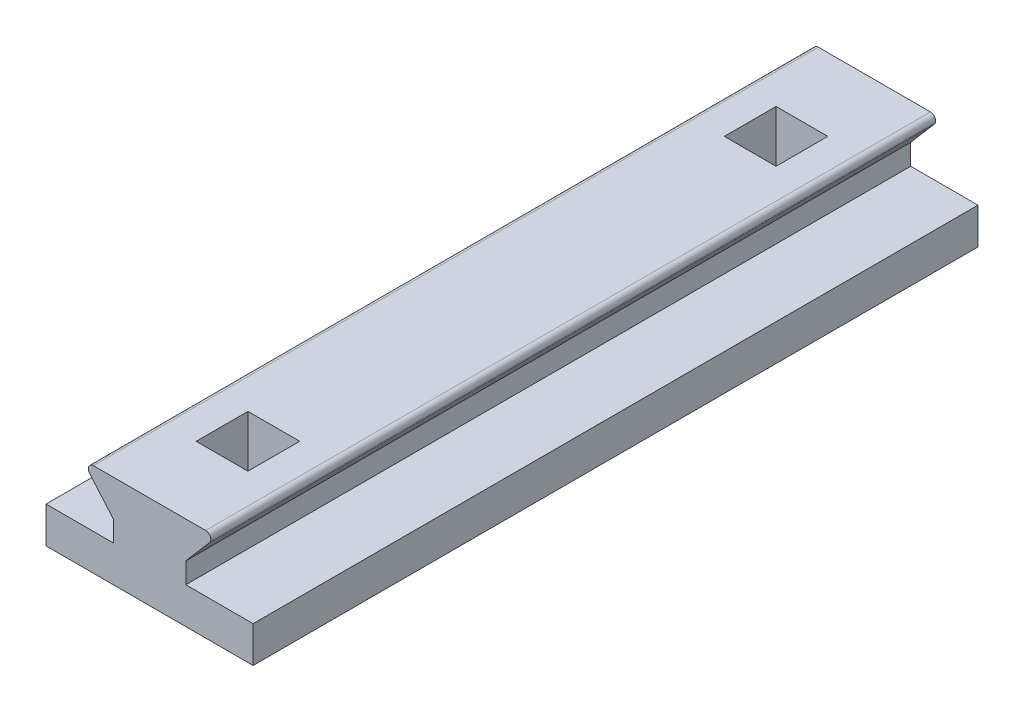
ISO-10303-21;
HEADER;
FILE_DESCRIPTION(('STEP AP214'),'2;1');
FILE_NAME('part.step','',(''),(''),'','','');
FILE_SCHEMA(('AUTOMOTIVE_DESIGN { 1 0 10303 214 1 1 1 1 }'));
ENDSEC;
DATA;
#1=APPLICATION_CONTEXT('core data for automotive mechanical design processes');
#2=APPLICATION_PROTOCOL_DEFINITION('international standard','automotive_design',2000,#1);
#3=PRODUCT_CONTEXT('',#1,'mechanical');
#4=PRODUCT('Part','Part','',(#3));
#5=PRODUCT_RELATED_PRODUCT_CATEGORY('part','',(#4));
#6=PRODUCT_DEFINITION_FORMATION('','',#4);
#7=PRODUCT_DEFINITION_CONTEXT('part definition',#1,'design');
#8=PRODUCT_DEFINITION('design','',#6,#7);
#9=PRODUCT_DEFINITION_SHAPE('','',#8);
#10=(LENGTH_UNIT() NAMED_UNIT(*) SI_UNIT(.MILLI.,.METRE.));
#11=(NAMED_UNIT(*) PLANE_ANGLE_UNIT() SI_UNIT($,.RADIAN.));
#12=(NAMED_UNIT(*) SI_UNIT($,.STERADIAN.) SOLID_ANGLE_UNIT());
#13=UNCERTAINTY_MEASURE_WITH_UNIT(LENGTH_MEASURE(1.E-05),#10,'distance_accuracy_value','');
#14=(GEOMETRIC_REPRESENTATION_CONTEXT(3) GLOBAL_UNCERTAINTY_ASSIGNED_CONTEXT((#13)) GLOBAL_UNIT_ASSIGNED_CONTEXT((#10,
#11,#12)) REPRESENTATION_CONTEXT('',''));
#15=CARTESIAN_POINT('',(0.,0.,0.));
#16=DIRECTION('',(0.,0.,1.));
#17=DIRECTION('',(1.,0.,0.));
#18=AXIS2_PLACEMENT_3D('',#15,#16,#17);
#19=CARTESIAN_POINT('',(0.,3.5,70.));
#20=DIRECTION('',(1.,0.,0.));
#21=DIRECTION('',(0.,1.,0.));
#22=AXIS2_PLACEMENT_3D('',#19,#20,#21);
#23=PLANE('',#22);
#24=DIRECTION('',(0.,-1.,0.));
#25=VECTOR('',#24,1.);
#26=CARTESIAN_POINT('',(0.,3.5,0.));
#27=LINE('',#26,#25);
#28=CARTESIAN_POINT('',(0.,3.5,0.));
#29=VERTEX_POINT('',#28);
#30=CARTESIAN_POINT('',(0.,0.,0.));
#31=VERTEX_POINT('',#30);
#32=EDGE_CURVE('E208',#29,#31,#27,.T.);
#33=ORIENTED_EDGE('',*,*,#32,.T.);
#34=DIRECTION('',(0.,0.,-1.));
#35=VECTOR('',#34,1.);
#36=CARTESIAN_POINT('',(0.,0.,70.));
#37=LINE('',#36,#35);
#38=CARTESIAN_POINT('',(0.,0.,70.));
#39=VERTEX_POINT('',#38);
#40=EDGE_CURVE('E308',#39,#31,#37,.T.);
#41=ORIENTED_EDGE('',*,*,#40,.F.);
#42=DIRECTION('',(0.,-1.,0.));
#43=VECTOR('',#42,1.);
#44=CARTESIAN_POINT('',(0.,3.5,70.));
#45=LINE('',#44,#43);
#46=CARTESIAN_POINT('',(0.,3.5,70.));
#47=VERTEX_POINT('',#46);
#48=EDGE_CURVE('E242',#47,#39,#45,.T.);
#49=ORIENTED_EDGE('',*,*,#48,.F.);
#50=DIRECTION('',(0.,0.,-1.));
#51=VECTOR('',#50,1.);
#52=CARTESIAN_POINT('',(0.,3.5,70.));
#53=LINE('',#52,#51);
#54=EDGE_CURVE('E266',#47,#29,#53,.T.);
#55=ORIENTED_EDGE('',*,*,#54,.T.);
#56=EDGE_LOOP('',(#33,#41,#49,#55));
#57=FACE_BOUND('',#56,.T.);
#58=ADVANCED_FACE('F33',(#57),#23,.F.);
#59=CARTESIAN_POINT('',(0.,0.,70.));
#60=DIRECTION('',(0.,1.,0.));
#61=DIRECTION('',(0.,0.,1.));
#62=AXIS2_PLACEMENT_3D('',#59,#60,#61);
#63=PLANE('',#62);
#64=CARTESIAN_POINT('',(10.,0.,9.5));
#65=DIRECTION('',(0.,1.,0.));
#66=DIRECTION('',(0.,0.,1.));
#67=AXIS2_PLACEMENT_3D('',#64,#65,#66);
#68=CIRCLE('',#67,2.);
#69=CARTESIAN_POINT('',(10.,0.,11.5));
#70=VERTEX_POINT('',#69);
#71=EDGE_CURVE('E228',#70,#70,#68,.T.);
#72=ORIENTED_EDGE('',*,*,#71,.T.);
#73=EDGE_LOOP('',(#72));
#74=FACE_BOUND('',#73,.T.);
#75=CARTESIAN_POINT('',(10.,0.,60.5));
#76=DIRECTION('',(0.,1.,0.));
#77=DIRECTION('',(0.,0.,1.));
#78=AXIS2_PLACEMENT_3D('',#75,#76,#77);
#79=CIRCLE('',#78,2.);
#80=CARTESIAN_POINT('',(10.,0.,62.5));
#81=VERTEX_POINT('',#80);
#82=EDGE_CURVE('E465',#81,#81,#79,.T.);
#83=ORIENTED_EDGE('',*,*,#82,.T.);
#84=EDGE_LOOP('',(#83));
#85=FACE_BOUND('',#84,.T.);
#86=DIRECTION('',(1.,0.,0.));
#87=VECTOR('',#86,1.);
#88=CARTESIAN_POINT('',(0.,0.,0.));
#89=LINE('',#88,#87);
#90=CARTESIAN_POINT('',(20.,0.,0.));
#91=VERTEX_POINT('',#90);
#92=EDGE_CURVE('E269',#31,#91,#89,.T.);
#93=ORIENTED_EDGE('',*,*,#92,.T.);
#94=DIRECTION('',(0.,0.,-1.));
#95=VECTOR('',#94,1.);
#96=CARTESIAN_POINT('',(20.,0.,70.));
#97=LINE('',#96,#95);
#98=CARTESIAN_POINT('',(20.,0.,70.));
#99=VERTEX_POINT('',#98);
#100=EDGE_CURVE('E305',#99,#91,#97,.T.);
#101=ORIENTED_EDGE('',*,*,#100,.F.);
#102=DIRECTION('',(1.,0.,0.));
#103=VECTOR('',#102,1.);
#104=CARTESIAN_POINT('',(0.,0.,70.));
#105=LINE('',#104,#103);
#106=EDGE_CURVE('E245',#39,#99,#105,.T.);
#107=ORIENTED_EDGE('',*,*,#106,.F.);
#108=ORIENTED_EDGE('',*,*,#40,.T.);
#109=EDGE_LOOP('',(#93,#101,#107,#108));
#110=FACE_BOUND('',#109,.T.);
#111=ADVANCED_FACE('F359',(#74,#85,#110),#63,.F.);
#112=CARTESIAN_POINT('',(20.,0.,70.));
#113=DIRECTION('',(-1.,0.,0.));
#114=DIRECTION('',(0.,0.,1.));
#115=AXIS2_PLACEMENT_3D('',#112,#113,#114);
#116=PLANE('',#115);
#117=DIRECTION('',(0.,1.,0.));
#118=VECTOR('',#117,1.);
#119=CARTESIAN_POINT('',(20.,0.,0.));
#120=LINE('',#119,#118);
#121=CARTESIAN_POINT('',(20.,3.5,0.));
#122=VERTEX_POINT('',#121);
#123=EDGE_CURVE('E271',#91,#122,#120,.T.);
#124=ORIENTED_EDGE('',*,*,#123,.T.);
#125=DIRECTION('',(0.,0.,-1.));
#126=VECTOR('',#125,1.);
#127=CARTESIAN_POINT('',(20.,3.5,70.));
#128=LINE('',#127,#126);
#129=CARTESIAN_POINT('',(20.,3.5,70.));
#130=VERTEX_POINT('',#129);
#131=EDGE_CURVE('E302',#130,#122,#128,.T.);
#132=ORIENTED_EDGE('',*,*,#131,.F.);
#133=DIRECTION('',(0.,1.,0.));
#134=VECTOR('',#133,1.);
#135=CARTESIAN_POINT('',(20.,0.,70.));
#136=LINE('',#135,#134);
#137=EDGE_CURVE('E248',#99,#130,#136,.T.);
#138=ORIENTED_EDGE('',*,*,#137,.F.);
#139=ORIENTED_EDGE('',*,*,#100,.T.);
#140=EDGE_LOOP('',(#124,#132,#138,#139));
#141=FACE_BOUND('',#140,.T.);
#142=ADVANCED_FACE('F364',(#141),#116,.F.);
#143=CARTESIAN_POINT('',(20.,3.5,70.));
#144=DIRECTION('',(0.,-1.,0.));
#145=DIRECTION('',(1.,0.,0.));
#146=AXIS2_PLACEMENT_3D('',#143,#144,#145);
#147=PLANE('',#146);
#148=DIRECTION('',(-1.,0.,0.));
#149=VECTOR('',#148,1.);
#150=CARTESIAN_POINT('',(20.,3.5,0.));
#151=LINE('',#150,#149);
#152=CARTESIAN_POINT('',(13.5,3.5,0.));
#153=VERTEX_POINT('',#152);
#154=EDGE_CURVE('E273',#122,#153,#151,.T.);
#155=ORIENTED_EDGE('',*,*,#154,.T.);
#156=DIRECTION('',(0.,0.,-1.));
#157=VECTOR('',#156,1.);
#158=CARTESIAN_POINT('',(13.5,3.5,70.));
#159=LINE('',#158,#157);
#160=CARTESIAN_POINT('',(13.5,3.5,70.));
#161=VERTEX_POINT('',#160);
#162=EDGE_CURVE('E299',#161,#153,#159,.T.);
#163=ORIENTED_EDGE('',*,*,#162,.F.);
#164=DIRECTION('',(-1.,0.,0.));
#165=VECTOR('',#164,1.);
#166=CARTESIAN_POINT('',(20.,3.5,70.));
#167=LINE('',#166,#165);
#168=EDGE_CURVE('E250',#130,#161,#167,.T.);
#169=ORIENTED_EDGE('',*,*,#168,.F.);
#170=ORIENTED_EDGE('',*,*,#131,.T.);
#171=EDGE_LOOP('',(#155,#163,#169,#170));
#172=FACE_BOUND('',#171,.T.);
#173=ADVANCED_FACE('F370',(#172),#147,.F.);
#174=CARTESIAN_POINT('',(13.5,3.5,70.));
#175=DIRECTION('',(-1.,0.,0.));
#176=DIRECTION('',(0.,0.,1.));
#177=AXIS2_PLACEMENT_3D('',#174,#175,#176);
#178=PLANE('',#177);
#179=DIRECTION('',(0.,1.,0.));
#180=VECTOR('',#179,1.);
#181=CARTESIAN_POINT('',(13.5,3.5,0.));
#182=LINE('',#181,#180);
#183=CARTESIAN_POINT('',(13.5,5.5,0.));
#184=VERTEX_POINT('',#183);
#185=EDGE_CURVE('E275',#153,#184,#182,.T.);
#186=ORIENTED_EDGE('',*,*,#185,.T.);
#187=DIRECTION('',(0.,0.,-1.));
#188=VECTOR('',#187,1.);
#189=CARTESIAN_POINT('',(13.5,5.5,70.));
#190=LINE('',#189,#188);
#191=CARTESIAN_POINT('',(13.5,5.5,70.));
#192=VERTEX_POINT('',#191);
#193=EDGE_CURVE('E296',#192,#184,#190,.T.);
#194=ORIENTED_EDGE('',*,*,#193,.F.);
#195=DIRECTION('',(0.,1.,0.));
#196=VECTOR('',#195,1.);
#197=CARTESIAN_POINT('',(13.5,3.5,70.));
#198=LINE('',#197,#196);
#199=EDGE_CURVE('E252',#161,#192,#198,.T.);
#200=ORIENTED_EDGE('',*,*,#199,.F.);
#201=ORIENTED_EDGE('',*,*,#162,.T.);
#202=EDGE_LOOP('',(#186,#194,#200,#201));
#203=FACE_BOUND('',#202,.T.);
#204=ADVANCED_FACE('F374',(#203),#178,.F.);
#205=CARTESIAN_POINT('',(16.5,9.,70.));
#206=DIRECTION('',(-0.759256602365297,0.650791373455968,0.));
#207=DIRECTION('',(-0.650791373455968,-0.759256602365297,0.));
#208=AXIS2_PLACEMENT_3D('',#205,#206,#207);
#209=PLANE('',#208);
#210=DIRECTION('',(0.650791373455968,0.759256602365297,0.));
#211=VECTOR('',#210,1.);
#212=CARTESIAN_POINT('',(16.5,9.,0.));
#213=LINE('',#212,#211);
#214=CARTESIAN_POINT('',(15.7925179828046,8.17460431327201,0.));
#215=VERTEX_POINT('',#214);
#216=EDGE_CURVE('E277',#184,#215,#213,.T.);
#217=ORIENTED_EDGE('',*,*,#216,.T.);
#218=DIRECTION('',(0.,0.,-1.));
#219=VECTOR('',#218,1.);
#220=CARTESIAN_POINT('',(15.7925179828046,8.17460431327201,70.));
#221=LINE('',#220,#219);
#222=CARTESIAN_POINT('',(15.7925179828046,8.17460431327201,70.));
#223=VERTEX_POINT('',#222);
#224=EDGE_CURVE('E316',#215,#223,#221,.F.);
#225=ORIENTED_EDGE('',*,*,#224,.T.);
#226=DIRECTION('',(0.650791373455968,0.759256602365297,0.));
#227=VECTOR('',#226,1.);
#228=CARTESIAN_POINT('',(16.5,9.,70.));
#229=LINE('',#228,#227);
#230=EDGE_CURVE('E254',#192,#223,#229,.T.);
#231=ORIENTED_EDGE('',*,*,#230,.F.);
#232=ORIENTED_EDGE('',*,*,#193,.T.);
#233=EDGE_LOOP('',(#217,#225,#231,#232));
#234=FACE_BOUND('',#233,.T.);
#235=ADVANCED_FACE('F378',(#234),#209,.F.);
#236=CARTESIAN_POINT('',(16.5,9.,70.));
#237=DIRECTION('',(0.,-1.,0.));
#238=DIRECTION('',(1.,0.,0.));
#239=AXIS2_PLACEMENT_3D('',#236,#237,#238);
#240=PLANE('',#239);
#241=DIRECTION('',(-1.,0.,0.));
#242=VECTOR('',#241,1.);
#243=CARTESIAN_POINT('',(12.5,9.,7.));
#244=LINE('',#243,#242);
#245=CARTESIAN_POINT('',(12.5,9.,7.00000000000001));
#246=VERTEX_POINT('',#245);
#247=CARTESIAN_POINT('',(7.5,9.,7.));
#248=VERTEX_POINT('',#247);
#249=EDGE_CURVE('E201',#246,#248,#244,.T.);
#250=ORIENTED_EDGE('',*,*,#249,.F.);
#251=DIRECTION('',(0.,0.,-1.));
#252=VECTOR('',#251,1.);
#253=CARTESIAN_POINT('',(12.5,9.,12.));
#254=LINE('',#253,#252);
#255=CARTESIAN_POINT('',(12.5,9.,12.));
#256=VERTEX_POINT('',#255);
#257=EDGE_CURVE('E48',#256,#246,#254,.T.);
#258=ORIENTED_EDGE('',*,*,#257,.F.);
#259=DIRECTION('',(1.,0.,0.));
#260=VECTOR('',#259,1.);
#261=CARTESIAN_POINT('',(12.5,9.,12.));
#262=LINE('',#261,#260);
#263=CARTESIAN_POINT('',(7.5,9.,12.));
#264=VERTEX_POINT('',#263);
#265=EDGE_CURVE('E189',#264,#256,#262,.T.);
#266=ORIENTED_EDGE('',*,*,#265,.F.);
#267=DIRECTION('',(0.,0.,1.));
#268=VECTOR('',#267,1.);
#269=CARTESIAN_POINT('',(7.5,9.,12.));
#270=LINE('',#269,#268);
#271=EDGE_CURVE('E192',#248,#264,#270,.T.);
#272=ORIENTED_EDGE('',*,*,#271,.F.);
#273=EDGE_LOOP('',(#250,#258,#266,#272));
#274=FACE_BOUND('',#273,.T.);
#275=DIRECTION('',(-1.,0.,0.));
#276=VECTOR('',#275,1.);
#277=CARTESIAN_POINT('',(12.5,9.,58.));
#278=LINE('',#277,#276);
#279=CARTESIAN_POINT('',(12.5,9.,58.));
#280=VERTEX_POINT('',#279);
#281=CARTESIAN_POINT('',(7.5,9.,58.));
#282=VERTEX_POINT('',#281);
#283=EDGE_CURVE('E227',#280,#282,#278,.T.);
#284=ORIENTED_EDGE('',*,*,#283,.F.);
#285=DIRECTION('',(0.,0.,-1.));
#286=VECTOR('',#285,1.);
#287=CARTESIAN_POINT('',(12.5,9.,63.));
#288=LINE('',#287,#286);
#289=CARTESIAN_POINT('',(12.5,9.,63.));
#290=VERTEX_POINT('',#289);
#291=EDGE_CURVE('E56',#290,#280,#288,.T.);
#292=ORIENTED_EDGE('',*,*,#291,.F.);
#293=DIRECTION('',(1.,0.,0.));
#294=VECTOR('',#293,1.);
#295=CARTESIAN_POINT('',(12.5,9.,63.));
#296=LINE('',#295,#294);
#297=CARTESIAN_POINT('',(7.5,9.,63.));
#298=VERTEX_POINT('',#297);
#299=EDGE_CURVE('E216',#298,#290,#296,.T.);
#300=ORIENTED_EDGE('',*,*,#299,.F.);
#301=DIRECTION('',(0.,0.,1.));
#302=VECTOR('',#301,1.);
#303=CARTESIAN_POINT('',(7.5,9.,63.));
#304=LINE('',#303,#302);
#305=EDGE_CURVE('E231',#282,#298,#304,.T.);
#306=ORIENTED_EDGE('',*,*,#305,.F.);
#307=EDGE_LOOP('',(#284,#292,#300,#306));
#308=FACE_BOUND('',#307,.T.);
#309=DIRECTION('',(-1.,0.,0.));
#310=VECTOR('',#309,1.);
#311=CARTESIAN_POINT('',(16.5,9.,0.));
#312=LINE('',#311,#310);
#313=CARTESIAN_POINT('',(15.4128896816219,9.,0.));
#314=VERTEX_POINT('',#313);
#315=CARTESIAN_POINT('',(4.58711031837806,9.,0.));
#316=VERTEX_POINT('',#315);
#317=EDGE_CURVE('E280',#314,#316,#312,.T.);
#318=ORIENTED_EDGE('',*,*,#317,.T.);
#319=DIRECTION('',(0.,0.,-1.));
#320=VECTOR('',#319,1.);
#321=CARTESIAN_POINT('',(4.58711031837806,9.,70.));
#322=LINE('',#321,#320);
#323=CARTESIAN_POINT('',(4.58711031837806,9.,70.));
#324=VERTEX_POINT('',#323);
#325=EDGE_CURVE('E41',#316,#324,#322,.F.);
#326=ORIENTED_EDGE('',*,*,#325,.T.);
#327=DIRECTION('',(-1.,0.,0.));
#328=VECTOR('',#327,1.);
#329=CARTESIAN_POINT('',(16.5,9.,70.));
#330=LINE('',#329,#328);
#331=CARTESIAN_POINT('',(15.4128896816219,9.,70.));
#332=VERTEX_POINT('',#331);
#333=EDGE_CURVE('E257',#332,#324,#330,.T.);
#334=ORIENTED_EDGE('',*,*,#333,.F.);
#335=DIRECTION('',(0.,0.,-1.));
#336=VECTOR('',#335,1.);
#337=CARTESIAN_POINT('',(15.4128896816219,9.,70.));
#338=LINE('',#337,#336);
#339=EDGE_CURVE('E311',#332,#314,#338,.T.);
#340=ORIENTED_EDGE('',*,*,#339,.T.);
#341=EDGE_LOOP('',(#318,#326,#334,#340));
#342=FACE_BOUND('',#341,.T.);
#343=ADVANCED_FACE('F327',(#274,#308,#342),#240,.F.);
#344=CARTESIAN_POINT('',(3.5,9.,70.));
#345=DIRECTION('',(0.759256602365296,0.650791373455969,0.));
#346=DIRECTION('',(-0.650791373455969,0.759256602365296,0.));
#347=AXIS2_PLACEMENT_3D('',#344,#345,#346);
#348=PLANE('',#347);
#349=DIRECTION('',(0.650791373455969,-0.759256602365296,0.));
#350=VECTOR('',#349,1.);
#351=CARTESIAN_POINT('',(3.5,9.,70.));
#352=LINE('',#351,#350);
#353=CARTESIAN_POINT('',(4.20748201719542,8.17460431327201,70.));
#354=VERTEX_POINT('',#353);
#355=CARTESIAN_POINT('',(6.5,5.5,70.));
#356=VERTEX_POINT('',#355);
#357=EDGE_CURVE('E260',#354,#356,#352,.T.);
#358=ORIENTED_EDGE('',*,*,#357,.F.);
#359=DIRECTION('',(0.,0.,-1.));
#360=VECTOR('',#359,1.);
#361=CARTESIAN_POINT('',(4.20748201719542,8.17460431327201,70.));
#362=LINE('',#361,#360);
#363=CARTESIAN_POINT('',(4.20748201719542,8.17460431327201,0.));
#364=VERTEX_POINT('',#363);
#365=EDGE_CURVE('E320',#354,#364,#362,.T.);
#366=ORIENTED_EDGE('',*,*,#365,.T.);
#367=DIRECTION('',(0.650791373455969,-0.759256602365296,0.));
#368=VECTOR('',#367,1.);
#369=CARTESIAN_POINT('',(3.5,9.,0.));
#370=LINE('',#369,#368);
#371=CARTESIAN_POINT('',(6.5,5.5,0.));
#372=VERTEX_POINT('',#371);
#373=EDGE_CURVE('E283',#364,#372,#370,.T.);
#374=ORIENTED_EDGE('',*,*,#373,.T.);
#375=DIRECTION('',(0.,0.,-1.));
#376=VECTOR('',#375,1.);
#377=CARTESIAN_POINT('',(6.5,5.5,70.));
#378=LINE('',#377,#376);
#379=EDGE_CURVE('E293',#356,#372,#378,.T.);
#380=ORIENTED_EDGE('',*,*,#379,.F.);
#381=EDGE_LOOP('',(#358,#366,#374,#380));
#382=FACE_BOUND('',#381,.T.);
#383=ADVANCED_FACE('F339',(#382),#348,.F.);
#384=CARTESIAN_POINT('',(6.5,5.5,70.));
#385=DIRECTION('',(1.,0.,0.));
#386=DIRECTION('',(0.,1.,0.));
#387=AXIS2_PLACEMENT_3D('',#384,#385,#386);
#388=PLANE('',#387);
#389=DIRECTION('',(0.,-1.,0.));
#390=VECTOR('',#389,1.);
#391=CARTESIAN_POINT('',(6.5,5.5,0.));
#392=LINE('',#391,#390);
#393=CARTESIAN_POINT('',(6.5,3.5,0.));
#394=VERTEX_POINT('',#393);
#395=EDGE_CURVE('E285',#372,#394,#392,.T.);
#396=ORIENTED_EDGE('',*,*,#395,.T.);
#397=DIRECTION('',(0.,0.,-1.));
#398=VECTOR('',#397,1.);
#399=CARTESIAN_POINT('',(6.5,3.5,70.));
#400=LINE('',#399,#398);
#401=CARTESIAN_POINT('',(6.5,3.5,70.));
#402=VERTEX_POINT('',#401);
#403=EDGE_CURVE('E290',#402,#394,#400,.T.);
#404=ORIENTED_EDGE('',*,*,#403,.F.);
#405=DIRECTION('',(0.,-1.,0.));
#406=VECTOR('',#405,1.);
#407=CARTESIAN_POINT('',(6.5,5.5,70.));
#408=LINE('',#407,#406);
#409=EDGE_CURVE('E262',#356,#402,#408,.T.);
#410=ORIENTED_EDGE('',*,*,#409,.F.);
#411=ORIENTED_EDGE('',*,*,#379,.T.);
#412=EDGE_LOOP('',(#396,#404,#410,#411));
#413=FACE_BOUND('',#412,.T.);
#414=ADVANCED_FACE('F348',(#413),#388,.F.);
#415=CARTESIAN_POINT('',(6.5,3.5,70.));
#416=DIRECTION('',(0.,-1.,0.));
#417=DIRECTION('',(1.,0.,0.));
#418=AXIS2_PLACEMENT_3D('',#415,#416,#417);
#419=PLANE('',#418);
#420=DIRECTION('',(-1.,0.,0.));
#421=VECTOR('',#420,1.);
#422=CARTESIAN_POINT('',(6.5,3.5,0.));
#423=LINE('',#422,#421);
#424=EDGE_CURVE('E246',#394,#29,#423,.T.);
#425=ORIENTED_EDGE('',*,*,#424,.T.);
#426=ORIENTED_EDGE('',*,*,#54,.F.);
#427=DIRECTION('',(-1.,0.,0.));
#428=VECTOR('',#427,1.);
#429=CARTESIAN_POINT('',(6.5,3.5,70.));
#430=LINE('',#429,#428);
#431=EDGE_CURVE('E264',#402,#47,#430,.T.);
#432=ORIENTED_EDGE('',*,*,#431,.F.);
#433=ORIENTED_EDGE('',*,*,#403,.T.);
#434=EDGE_LOOP('',(#425,#426,#432,#433));
#435=FACE_BOUND('',#434,.T.);
#436=ADVANCED_FACE('F352',(#435),#419,.F.);
#437=CARTESIAN_POINT('',(0.,0.,70.));
#438=DIRECTION('',(0.,0.,1.));
#439=DIRECTION('',(1.,0.,0.));
#440=AXIS2_PLACEMENT_3D('',#437,#438,#439);
#441=PLANE('',#440);
#442=ORIENTED_EDGE('',*,*,#333,.T.);
#443=CARTESIAN_POINT('',(4.58711031837806,8.5,70.));
#444=DIRECTION('',(0.,0.,1.));
#445=DIRECTION('',(1.,0.,0.));
#446=AXIS2_PLACEMENT_3D('',#443,#444,#445);
#447=CIRCLE('',#446,0.5);
#448=EDGE_CURVE('E11',#324,#354,#447,.T.);
#449=ORIENTED_EDGE('',*,*,#448,.T.);
#450=ORIENTED_EDGE('',*,*,#357,.T.);
#451=ORIENTED_EDGE('',*,*,#409,.T.);
#452=ORIENTED_EDGE('',*,*,#431,.T.);
#453=ORIENTED_EDGE('',*,*,#48,.T.);
#454=ORIENTED_EDGE('',*,*,#106,.T.);
#455=ORIENTED_EDGE('',*,*,#137,.T.);
#456=ORIENTED_EDGE('',*,*,#168,.T.);
#457=ORIENTED_EDGE('',*,*,#199,.T.);
#458=ORIENTED_EDGE('',*,*,#230,.T.);
#459=CARTESIAN_POINT('',(15.4128896816219,8.5,70.));
#460=DIRECTION('',(0.,0.,1.));
#461=DIRECTION('',(1.,0.,0.));
#462=AXIS2_PLACEMENT_3D('',#459,#460,#461);
#463=CIRCLE('',#462,0.5);
#464=EDGE_CURVE('E318',#223,#332,#463,.T.);
#465=ORIENTED_EDGE('',*,*,#464,.T.);
#466=EDGE_LOOP('',(#442,#449,#450,#451,#452,#453,#454,#455,#456,#457,#458,#465));
#467=FACE_BOUND('',#466,.T.);
#468=ADVANCED_FACE('F333',(#467),#441,.T.);
#469=CARTESIAN_POINT('',(0.,0.,0.));
#470=DIRECTION('',(0.,0.,1.));
#471=DIRECTION('',(1.,0.,0.));
#472=AXIS2_PLACEMENT_3D('',#469,#470,#471);
#473=PLANE('',#472);
#474=ORIENTED_EDGE('',*,*,#373,.F.);
#475=CARTESIAN_POINT('',(4.58711031837806,8.5,0.));
#476=DIRECTION('',(0.,0.,1.));
#477=DIRECTION('',(1.,0.,0.));
#478=AXIS2_PLACEMENT_3D('',#475,#476,#477);
#479=CIRCLE('',#478,0.5);
#480=EDGE_CURVE('E323',#364,#316,#479,.F.);
#481=ORIENTED_EDGE('',*,*,#480,.T.);
#482=ORIENTED_EDGE('',*,*,#317,.F.);
#483=CARTESIAN_POINT('',(15.4128896816219,8.5,0.));
#484=DIRECTION('',(0.,0.,1.));
#485=DIRECTION('',(1.,0.,0.));
#486=AXIS2_PLACEMENT_3D('',#483,#484,#485);
#487=CIRCLE('',#486,0.5);
#488=EDGE_CURVE('E314',#314,#215,#487,.F.);
#489=ORIENTED_EDGE('',*,*,#488,.T.);
#490=ORIENTED_EDGE('',*,*,#216,.F.);
#491=ORIENTED_EDGE('',*,*,#185,.F.);
#492=ORIENTED_EDGE('',*,*,#154,.F.);
#493=ORIENTED_EDGE('',*,*,#123,.F.);
#494=ORIENTED_EDGE('',*,*,#92,.F.);
#495=ORIENTED_EDGE('',*,*,#32,.F.);
#496=ORIENTED_EDGE('',*,*,#424,.F.);
#497=ORIENTED_EDGE('',*,*,#395,.F.);
#498=EDGE_LOOP('',(#474,#481,#482,#489,#490,#491,#492,#493,#494,#495,#496,#497));
#499=FACE_BOUND('',#498,.T.);
#500=ADVANCED_FACE('F343',(#499),#473,.F.);
#501=CARTESIAN_POINT('',(15.4128896816219,8.5,70.));
#502=DIRECTION('',(0.,0.,-1.));
#503=DIRECTION('',(-1.,0.,0.));
#504=AXIS2_PLACEMENT_3D('',#501,#502,#503);
#505=CYLINDRICAL_SURFACE('',#504,0.5);
#506=ORIENTED_EDGE('',*,*,#464,.F.);
#507=ORIENTED_EDGE('',*,*,#224,.F.);
#508=ORIENTED_EDGE('',*,*,#488,.F.);
#509=ORIENTED_EDGE('',*,*,#339,.F.);
#510=EDGE_LOOP('',(#506,#507,#508,#509));
#511=FACE_BOUND('',#510,.T.);
#512=ADVANCED_FACE('F381',(#511),#505,.T.);
#513=CARTESIAN_POINT('',(4.58711031837806,8.5,70.));
#514=DIRECTION('',(0.,0.,-1.));
#515=DIRECTION('',(-1.,0.,0.));
#516=AXIS2_PLACEMENT_3D('',#513,#514,#515);
#517=CYLINDRICAL_SURFACE('',#516,0.5);
#518=ORIENTED_EDGE('',*,*,#448,.F.);
#519=ORIENTED_EDGE('',*,*,#325,.F.);
#520=ORIENTED_EDGE('',*,*,#480,.F.);
#521=ORIENTED_EDGE('',*,*,#365,.F.);
#522=EDGE_LOOP('',(#518,#519,#520,#521));
#523=FACE_BOUND('',#522,.T.);
#524=ADVANCED_FACE('F35',(#523),#517,.T.);
#525=CARTESIAN_POINT('',(12.5,4.,63.));
#526=DIRECTION('',(1.,0.,0.));
#527=DIRECTION('',(0.,1.,0.));
#528=AXIS2_PLACEMENT_3D('',#525,#526,#527);
#529=PLANE('',#528);
#530=ORIENTED_EDGE('',*,*,#291,.T.);
#531=DIRECTION('',(0.,1.,0.));
#532=VECTOR('',#531,1.);
#533=CARTESIAN_POINT('',(12.5,4.,58.));
#534=LINE('',#533,#532);
#535=CARTESIAN_POINT('',(12.5,4.,58.));
#536=VERTEX_POINT('',#535);
#537=EDGE_CURVE('E225',#536,#280,#534,.T.);
#538=ORIENTED_EDGE('',*,*,#537,.F.);
#539=DIRECTION('',(0.,0.,-1.));
#540=VECTOR('',#539,1.);
#541=CARTESIAN_POINT('',(12.5,4.,63.));
#542=LINE('',#541,#540);
#543=CARTESIAN_POINT('',(12.5,4.,63.));
#544=VERTEX_POINT('',#543);
#545=EDGE_CURVE('E212',#544,#536,#542,.T.);
#546=ORIENTED_EDGE('',*,*,#545,.F.);
#547=DIRECTION('',(0.,1.,0.));
#548=VECTOR('',#547,1.);
#549=CARTESIAN_POINT('',(12.5,4.,63.));
#550=LINE('',#549,#548);
#551=EDGE_CURVE('E202',#544,#290,#550,.T.);
#552=ORIENTED_EDGE('',*,*,#551,.T.);
#553=EDGE_LOOP('',(#530,#538,#546,#552));
#554=FACE_BOUND('',#553,.T.);
#555=ADVANCED_FACE('F387',(#554),#529,.F.);
#556=CARTESIAN_POINT('',(12.5,4.,63.));
#557=DIRECTION('',(0.,0.,1.));
#558=DIRECTION('',(1.,0.,0.));
#559=AXIS2_PLACEMENT_3D('',#556,#557,#558);
#560=PLANE('',#559);
#561=ORIENTED_EDGE('',*,*,#299,.T.);
#562=ORIENTED_EDGE('',*,*,#551,.F.);
#563=DIRECTION('',(1.,0.,0.));
#564=VECTOR('',#563,1.);
#565=CARTESIAN_POINT('',(12.5,4.,63.));
#566=LINE('',#565,#564);
#567=CARTESIAN_POINT('',(7.5,4.,63.));
#568=VERTEX_POINT('',#567);
#569=EDGE_CURVE('E222',#568,#544,#566,.T.);
#570=ORIENTED_EDGE('',*,*,#569,.F.);
#571=DIRECTION('',(0.,1.,0.));
#572=VECTOR('',#571,1.);
#573=CARTESIAN_POINT('',(7.5,4.,63.));
#574=LINE('',#573,#572);
#575=EDGE_CURVE('E237',#568,#298,#574,.T.);
#576=ORIENTED_EDGE('',*,*,#575,.T.);
#577=EDGE_LOOP('',(#561,#562,#570,#576));
#578=FACE_BOUND('',#577,.T.);
#579=ADVANCED_FACE('F419',(#578),#560,.F.);
#580=CARTESIAN_POINT('',(7.5,4.,63.));
#581=DIRECTION('',(-1.,0.,0.));
#582=DIRECTION('',(0.,-1.,0.));
#583=AXIS2_PLACEMENT_3D('',#580,#581,#582);
#584=PLANE('',#583);
#585=ORIENTED_EDGE('',*,*,#305,.T.);
#586=ORIENTED_EDGE('',*,*,#575,.F.);
#587=DIRECTION('',(0.,0.,1.));
#588=VECTOR('',#587,1.);
#589=CARTESIAN_POINT('',(7.5,4.,63.));
#590=LINE('',#589,#588);
#591=CARTESIAN_POINT('',(7.5,4.,58.));
#592=VERTEX_POINT('',#591);
#593=EDGE_CURVE('E219',#592,#568,#590,.T.);
#594=ORIENTED_EDGE('',*,*,#593,.F.);
#595=DIRECTION('',(0.,1.,0.));
#596=VECTOR('',#595,1.);
#597=CARTESIAN_POINT('',(7.5,4.,58.));
#598=LINE('',#597,#596);
#599=EDGE_CURVE('E239',#592,#282,#598,.T.);
#600=ORIENTED_EDGE('',*,*,#599,.T.);
#601=EDGE_LOOP('',(#585,#586,#594,#600));
#602=FACE_BOUND('',#601,.T.);
#603=ADVANCED_FACE('F424',(#602),#584,.F.);
#604=CARTESIAN_POINT('',(12.5,4.,58.));
#605=DIRECTION('',(0.,0.,-1.));
#606=DIRECTION('',(-1.,0.,0.));
#607=AXIS2_PLACEMENT_3D('',#604,#605,#606);
#608=PLANE('',#607);
#609=ORIENTED_EDGE('',*,*,#283,.T.);
#610=ORIENTED_EDGE('',*,*,#599,.F.);
#611=DIRECTION('',(-1.,0.,0.));
#612=VECTOR('',#611,1.);
#613=CARTESIAN_POINT('',(12.5,4.,58.));
#614=LINE('',#613,#612);
#615=EDGE_CURVE('E215',#536,#592,#614,.T.);
#616=ORIENTED_EDGE('',*,*,#615,.F.);
#617=ORIENTED_EDGE('',*,*,#537,.T.);
#618=EDGE_LOOP('',(#609,#610,#616,#617));
#619=FACE_BOUND('',#618,.T.);
#620=ADVANCED_FACE('F420',(#619),#608,.F.);
#621=CARTESIAN_POINT('',(0.,4.,0.));
#622=DIRECTION('',(0.,1.,0.));
#623=DIRECTION('',(0.,0.,1.));
#624=AXIS2_PLACEMENT_3D('',#621,#622,#623);
#625=PLANE('',#624);
#626=CARTESIAN_POINT('',(10.,4.,60.5));
#627=DIRECTION('',(0.,1.,0.));
#628=DIRECTION('',(0.,0.,1.));
#629=AXIS2_PLACEMENT_3D('',#626,#627,#628);
#630=CIRCLE('',#629,2.);
#631=CARTESIAN_POINT('',(10.,4.,62.5));
#632=VERTEX_POINT('',#631);
#633=EDGE_CURVE('E195',#632,#632,#630,.T.);
#634=ORIENTED_EDGE('',*,*,#633,.F.);
#635=EDGE_LOOP('',(#634));
#636=FACE_BOUND('',#635,.T.);
#637=ORIENTED_EDGE('',*,*,#545,.T.);
#638=ORIENTED_EDGE('',*,*,#615,.T.);
#639=ORIENTED_EDGE('',*,*,#593,.T.);
#640=ORIENTED_EDGE('',*,*,#569,.T.);
#641=EDGE_LOOP('',(#637,#638,#639,#640));
#642=FACE_BOUND('',#641,.T.);
#643=ADVANCED_FACE('F423',(#636,#642),#625,.T.);
#644=CARTESIAN_POINT('',(12.5,4.,12.));
#645=DIRECTION('',(1.,0.,0.));
#646=DIRECTION('',(0.,1.,0.));
#647=AXIS2_PLACEMENT_3D('',#644,#645,#646);
#648=PLANE('',#647);
#649=ORIENTED_EDGE('',*,*,#257,.T.);
#650=DIRECTION('',(0.,1.,0.));
#651=VECTOR('',#650,1.);
#652=CARTESIAN_POINT('',(12.5,4.,7.));
#653=LINE('',#652,#651);
#654=CARTESIAN_POINT('',(12.5,4.,7.));
#655=VERTEX_POINT('',#654);
#656=EDGE_CURVE('E167',#655,#246,#653,.T.);
#657=ORIENTED_EDGE('',*,*,#656,.F.);
#658=DIRECTION('',(0.,0.,-1.));
#659=VECTOR('',#658,1.);
#660=CARTESIAN_POINT('',(12.5,4.,12.));
#661=LINE('',#660,#659);
#662=CARTESIAN_POINT('',(12.5,4.,12.));
#663=VERTEX_POINT('',#662);
#664=EDGE_CURVE('E171',#663,#655,#661,.T.);
#665=ORIENTED_EDGE('',*,*,#664,.F.);
#666=DIRECTION('',(0.,1.,0.));
#667=VECTOR('',#666,1.);
#668=CARTESIAN_POINT('',(12.5,4.,12.));
#669=LINE('',#668,#667);
#670=EDGE_CURVE('E206',#663,#256,#669,.T.);
#671=ORIENTED_EDGE('',*,*,#670,.T.);
#672=EDGE_LOOP('',(#649,#657,#665,#671));
#673=FACE_BOUND('',#672,.T.);
#674=ADVANCED_FACE('F169',(#673),#648,.F.);
#675=CARTESIAN_POINT('',(12.5,4.,12.));
#676=DIRECTION('',(0.,0.,1.));
#677=DIRECTION('',(1.,0.,0.));
#678=AXIS2_PLACEMENT_3D('',#675,#676,#677);
#679=PLANE('',#678);
#680=ORIENTED_EDGE('',*,*,#265,.T.);
#681=ORIENTED_EDGE('',*,*,#670,.F.);
#682=DIRECTION('',(1.,0.,0.));
#683=VECTOR('',#682,1.);
#684=CARTESIAN_POINT('',(12.5,4.,12.));
#685=LINE('',#684,#683);
#686=CARTESIAN_POINT('',(7.5,4.,12.));
#687=VERTEX_POINT('',#686);
#688=EDGE_CURVE('E177',#687,#663,#685,.T.);
#689=ORIENTED_EDGE('',*,*,#688,.F.);
#690=DIRECTION('',(0.,1.,0.));
#691=VECTOR('',#690,1.);
#692=CARTESIAN_POINT('',(7.5,4.,12.));
#693=LINE('',#692,#691);
#694=EDGE_CURVE('E209',#687,#264,#693,.T.);
#695=ORIENTED_EDGE('',*,*,#694,.T.);
#696=EDGE_LOOP('',(#680,#681,#689,#695));
#697=FACE_BOUND('',#696,.T.);
#698=ADVANCED_FACE('F437',(#697),#679,.F.);
#699=CARTESIAN_POINT('',(7.5,4.,12.));
#700=DIRECTION('',(-1.,0.,0.));
#701=DIRECTION('',(0.,0.,1.));
#702=AXIS2_PLACEMENT_3D('',#699,#700,#701);
#703=PLANE('',#702);
#704=ORIENTED_EDGE('',*,*,#271,.T.);
#705=ORIENTED_EDGE('',*,*,#694,.F.);
#706=DIRECTION('',(0.,0.,1.));
#707=VECTOR('',#706,1.);
#708=CARTESIAN_POINT('',(7.5,4.,12.));
#709=LINE('',#708,#707);
#710=CARTESIAN_POINT('',(7.5,4.,7.));
#711=VERTEX_POINT('',#710);
#712=EDGE_CURVE('E185',#711,#687,#709,.T.);
#713=ORIENTED_EDGE('',*,*,#712,.F.);
#714=DIRECTION('',(0.,1.,0.));
#715=VECTOR('',#714,1.);
#716=CARTESIAN_POINT('',(7.5,4.,7.));
#717=LINE('',#716,#715);
#718=EDGE_CURVE('E176',#711,#248,#717,.T.);
#719=ORIENTED_EDGE('',*,*,#718,.T.);
#720=EDGE_LOOP('',(#704,#705,#713,#719));
#721=FACE_BOUND('',#720,.T.);
#722=ADVANCED_FACE('F440',(#721),#703,.F.);
#723=CARTESIAN_POINT('',(12.5,4.,7.));
#724=DIRECTION('',(0.,0.,-1.));
#725=DIRECTION('',(-1.,0.,0.));
#726=AXIS2_PLACEMENT_3D('',#723,#724,#725);
#727=PLANE('',#726);
#728=ORIENTED_EDGE('',*,*,#249,.T.);
#729=ORIENTED_EDGE('',*,*,#718,.F.);
#730=DIRECTION('',(-1.,0.,0.));
#731=VECTOR('',#730,1.);
#732=CARTESIAN_POINT('',(12.5,4.,7.));
#733=LINE('',#732,#731);
#734=EDGE_CURVE('E180',#655,#711,#733,.T.);
#735=ORIENTED_EDGE('',*,*,#734,.F.);
#736=ORIENTED_EDGE('',*,*,#656,.T.);
#737=EDGE_LOOP('',(#728,#729,#735,#736));
#738=FACE_BOUND('',#737,.T.);
#739=ADVANCED_FACE('F181',(#738),#727,.F.);
#740=CARTESIAN_POINT('',(0.,4.,0.));
#741=DIRECTION('',(0.,1.,0.));
#742=DIRECTION('',(0.,0.,1.));
#743=AXIS2_PLACEMENT_3D('',#740,#741,#742);
#744=PLANE('',#743);
#745=CARTESIAN_POINT('',(10.,4.,9.5));
#746=DIRECTION('',(0.,1.,0.));
#747=DIRECTION('',(0.,0.,1.));
#748=AXIS2_PLACEMENT_3D('',#745,#746,#747);
#749=CIRCLE('',#748,2.);
#750=CARTESIAN_POINT('',(10.,4.,11.5));
#751=VERTEX_POINT('',#750);
#752=EDGE_CURVE('E464',#751,#751,#749,.T.);
#753=ORIENTED_EDGE('',*,*,#752,.F.);
#754=EDGE_LOOP('',(#753));
#755=FACE_BOUND('',#754,.T.);
#756=ORIENTED_EDGE('',*,*,#664,.T.);
#757=ORIENTED_EDGE('',*,*,#734,.T.);
#758=ORIENTED_EDGE('',*,*,#712,.T.);
#759=ORIENTED_EDGE('',*,*,#688,.T.);
#760=EDGE_LOOP('',(#756,#757,#758,#759));
#761=FACE_BOUND('',#760,.T.);
#762=ADVANCED_FACE('F187',(#755,#761),#744,.T.);
#763=CARTESIAN_POINT('',(10.,0.,60.5));
#764=DIRECTION('',(0.,1.,0.));
#765=DIRECTION('',(0.,0.,1.));
#766=AXIS2_PLACEMENT_3D('',#763,#764,#765);
#767=CYLINDRICAL_SURFACE('',#766,2.);
#768=ORIENTED_EDGE('',*,*,#82,.F.);
#769=EDGE_LOOP('',(#768));
#770=FACE_BOUND('',#769,.T.);
#771=ORIENTED_EDGE('',*,*,#633,.T.);
#772=EDGE_LOOP('',(#771));
#773=FACE_BOUND('',#772,.T.);
#774=ADVANCED_FACE('F449',(#770,#773),#767,.F.);
#775=CARTESIAN_POINT('',(10.,0.,9.5));
#776=DIRECTION('',(0.,1.,0.));
#777=DIRECTION('',(0.,0.,1.));
#778=AXIS2_PLACEMENT_3D('',#775,#776,#777);
#779=CYLINDRICAL_SURFACE('',#778,2.);
#780=ORIENTED_EDGE('',*,*,#71,.F.);
#781=EDGE_LOOP('',(#780));
#782=FACE_BOUND('',#781,.T.);
#783=ORIENTED_EDGE('',*,*,#752,.T.);
#784=EDGE_LOOP('',(#783));
#785=FACE_BOUND('',#784,.T.);
#786=ADVANCED_FACE('F453',(#782,#785),#779,.F.);
#787=CLOSED_SHELL('',(#58,#111,#142,#173,#204,#235,#343,#383,#414,#436,#468,#500,#512,#524,#555,
#579,#603,#620,#643,#674,#698,#722,#739,#762,#774,#786));
#788=MANIFOLD_SOLID_BREP('B2',#787);
#789=ADVANCED_BREP_SHAPE_REPRESENTATION('',(#18,#788),#14);
#790=SHAPE_DEFINITION_REPRESENTATION(#9,#789);
ENDSEC;
END-ISO-10303-21;
